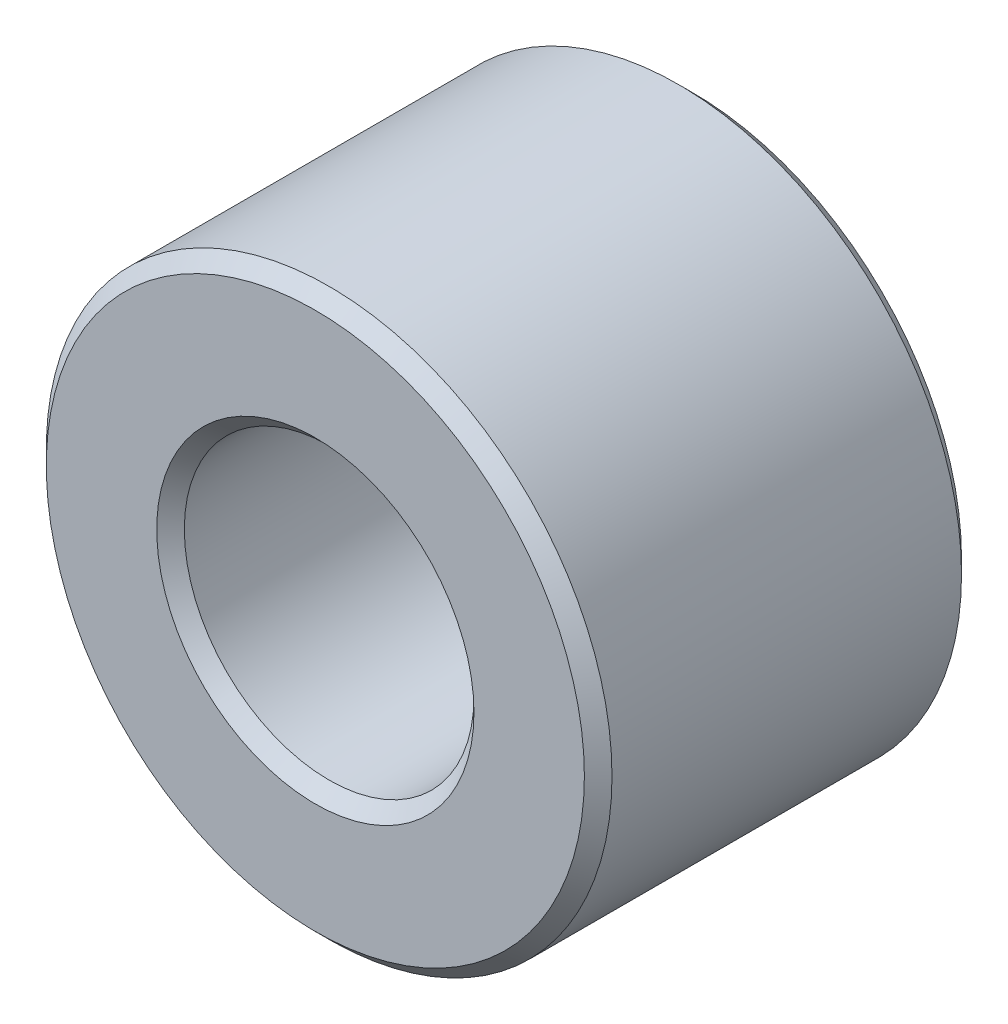
ISO-10303-21;
HEADER;
FILE_DESCRIPTION(('STEP AP214'),'2;1');
FILE_NAME('part.step','',(''),(''),'','','');
FILE_SCHEMA(('AUTOMOTIVE_DESIGN { 1 0 10303 214 1 1 1 1 }'));
ENDSEC;
DATA;
#1=APPLICATION_CONTEXT('core data for automotive mechanical design processes');
#2=APPLICATION_PROTOCOL_DEFINITION('international standard','automotive_design',2000,#1);
#3=PRODUCT_CONTEXT('',#1,'mechanical');
#4=PRODUCT('Part','Part','',(#3));
#5=PRODUCT_RELATED_PRODUCT_CATEGORY('part','',(#4));
#6=PRODUCT_DEFINITION_FORMATION('','',#4);
#7=PRODUCT_DEFINITION_CONTEXT('part definition',#1,'design');
#8=PRODUCT_DEFINITION('design','',#6,#7);
#9=PRODUCT_DEFINITION_SHAPE('','',#8);
#10=(LENGTH_UNIT() NAMED_UNIT(*) SI_UNIT(.MILLI.,.METRE.));
#11=(NAMED_UNIT(*) PLANE_ANGLE_UNIT() SI_UNIT($,.RADIAN.));
#12=(NAMED_UNIT(*) SI_UNIT($,.STERADIAN.) SOLID_ANGLE_UNIT());
#13=UNCERTAINTY_MEASURE_WITH_UNIT(LENGTH_MEASURE(1.E-05),#10,'distance_accuracy_value','');
#14=(GEOMETRIC_REPRESENTATION_CONTEXT(3) GLOBAL_UNCERTAINTY_ASSIGNED_CONTEXT((#13)) GLOBAL_UNIT_ASSIGNED_CONTEXT((#10,
#11,#12)) REPRESENTATION_CONTEXT('',''));
#15=CARTESIAN_POINT('',(0.,0.,0.));
#16=DIRECTION('',(0.,0.,1.));
#17=DIRECTION('',(1.,0.,0.));
#18=AXIS2_PLACEMENT_3D('',#15,#16,#17);
#19=CARTESIAN_POINT('',(0.,0.,-3.175));
#20=DIRECTION('',(0.,0.,1.));
#21=DIRECTION('',(1.,0.,0.));
#22=AXIS2_PLACEMENT_3D('',#19,#20,#21);
#23=CYLINDRICAL_SURFACE('',#22,4.7625);
#24=CARTESIAN_POINT('',(0.,0.,2.94259));
#25=DIRECTION('',(0.,0.,1.));
#26=DIRECTION('',(1.,0.,0.));
#27=AXIS2_PLACEMENT_3D('',#24,#25,#26);
#28=CIRCLE('',#27,4.7625);
#29=CARTESIAN_POINT('',(4.7625,0.,2.94259));
#30=VERTEX_POINT('',#29);
#31=EDGE_CURVE('E55',#30,#30,#28,.F.);
#32=ORIENTED_EDGE('',*,*,#31,.T.);
#33=EDGE_LOOP('',(#32));
#34=FACE_BOUND('',#33,.T.);
#35=CARTESIAN_POINT('',(0.,0.,-2.94259));
#36=DIRECTION('',(0.,0.,1.));
#37=DIRECTION('',(1.,0.,0.));
#38=AXIS2_PLACEMENT_3D('',#35,#36,#37);
#39=CIRCLE('',#38,4.7625);
#40=CARTESIAN_POINT('',(4.7625,0.,-2.94259));
#41=VERTEX_POINT('',#40);
#42=EDGE_CURVE('E58',#41,#41,#39,.T.);
#43=ORIENTED_EDGE('',*,*,#42,.T.);
#44=EDGE_LOOP('',(#43));
#45=FACE_BOUND('',#44,.T.);
#46=ADVANCED_FACE('F35',(#34,#45),#23,.T.);
#47=CARTESIAN_POINT('',(0.,0.,-3.175));
#48=DIRECTION('',(0.,0.,1.));
#49=DIRECTION('',(1.,0.,0.));
#50=AXIS2_PLACEMENT_3D('',#47,#48,#49);
#51=PLANE('',#50);
#52=CARTESIAN_POINT('',(0.,0.,-3.175));
#53=DIRECTION('',(0.,0.,1.));
#54=DIRECTION('',(1.,0.,0.));
#55=AXIS2_PLACEMENT_3D('',#52,#53,#54);
#56=CIRCLE('',#55,4.53009);
#57=CARTESIAN_POINT('',(4.53009,0.,-3.175));
#58=VERTEX_POINT('',#57);
#59=EDGE_CURVE('E46',#58,#58,#56,.F.);
#60=ORIENTED_EDGE('',*,*,#59,.T.);
#61=EDGE_LOOP('',(#60));
#62=FACE_BOUND('',#61,.T.);
#63=CARTESIAN_POINT('',(0.,0.,-3.175));
#64=DIRECTION('',(0.,0.,1.));
#65=DIRECTION('',(1.,0.,0.));
#66=AXIS2_PLACEMENT_3D('',#63,#64,#65);
#67=CIRCLE('',#66,2.67081);
#68=CARTESIAN_POINT('',(2.67081,0.,-3.175));
#69=VERTEX_POINT('',#68);
#70=EDGE_CURVE('E50',#69,#69,#67,.T.);
#71=ORIENTED_EDGE('',*,*,#70,.T.);
#72=EDGE_LOOP('',(#71));
#73=FACE_BOUND('',#72,.T.);
#74=ADVANCED_FACE('F83',(#62,#73),#51,.F.);
#75=CARTESIAN_POINT('',(0.,0.,-3.175));
#76=DIRECTION('',(0.,0.,1.));
#77=DIRECTION('',(1.,0.,0.));
#78=AXIS2_PLACEMENT_3D('',#75,#76,#77);
#79=CYLINDRICAL_SURFACE('',#78,2.4384);
#80=CARTESIAN_POINT('',(0.,0.,2.94259));
#81=DIRECTION('',(0.,0.,1.));
#82=DIRECTION('',(1.,0.,0.));
#83=AXIS2_PLACEMENT_3D('',#80,#81,#82);
#84=CIRCLE('',#83,2.4384);
#85=CARTESIAN_POINT('',(2.4384,0.,2.94259));
#86=VERTEX_POINT('',#85);
#87=EDGE_CURVE('E10',#86,#86,#84,.T.);
#88=ORIENTED_EDGE('',*,*,#87,.T.);
#89=EDGE_LOOP('',(#88));
#90=FACE_BOUND('',#89,.T.);
#91=CARTESIAN_POINT('',(0.,0.,-2.94259));
#92=DIRECTION('',(0.,0.,1.));
#93=DIRECTION('',(1.,0.,0.));
#94=AXIS2_PLACEMENT_3D('',#91,#92,#93);
#95=CIRCLE('',#94,2.4384);
#96=CARTESIAN_POINT('',(2.4384,0.,-2.94259));
#97=VERTEX_POINT('',#96);
#98=EDGE_CURVE('E42',#97,#97,#95,.F.);
#99=ORIENTED_EDGE('',*,*,#98,.T.);
#100=EDGE_LOOP('',(#99));
#101=FACE_BOUND('',#100,.T.);
#102=ADVANCED_FACE('F89',(#90,#101),#79,.F.);
#103=CARTESIAN_POINT('',(0.,0.,3.175));
#104=DIRECTION('',(0.,0.,1.));
#105=DIRECTION('',(1.,0.,0.));
#106=AXIS2_PLACEMENT_3D('',#103,#104,#105);
#107=PLANE('',#106);
#108=CARTESIAN_POINT('',(0.,0.,3.175));
#109=DIRECTION('',(0.,0.,1.));
#110=DIRECTION('',(1.,0.,0.));
#111=AXIS2_PLACEMENT_3D('',#108,#109,#110);
#112=CIRCLE('',#111,4.53009);
#113=CARTESIAN_POINT('',(4.53009,0.,3.175));
#114=VERTEX_POINT('',#113);
#115=EDGE_CURVE('E61',#114,#114,#112,.T.);
#116=ORIENTED_EDGE('',*,*,#115,.T.);
#117=EDGE_LOOP('',(#116));
#118=FACE_BOUND('',#117,.T.);
#119=CARTESIAN_POINT('',(0.,0.,3.175));
#120=DIRECTION('',(0.,0.,1.));
#121=DIRECTION('',(1.,0.,0.));
#122=AXIS2_PLACEMENT_3D('',#119,#120,#121);
#123=CIRCLE('',#122,2.67081);
#124=CARTESIAN_POINT('',(2.67081,0.,3.175));
#125=VERTEX_POINT('',#124);
#126=EDGE_CURVE('E64',#125,#125,#123,.F.);
#127=ORIENTED_EDGE('',*,*,#126,.T.);
#128=EDGE_LOOP('',(#127));
#129=FACE_BOUND('',#128,.T.);
#130=ADVANCED_FACE('F68',(#118,#129),#107,.T.);
#131=CARTESIAN_POINT('',(0.,0.,3.175));
#132=DIRECTION('',(0.,0.,-1.));
#133=DIRECTION('',(-1.,0.,0.));
#134=AXIS2_PLACEMENT_3D('',#131,#132,#133);
#135=CONICAL_SURFACE('',#134,4.53009,0.785398163397446);
#136=ORIENTED_EDGE('',*,*,#31,.F.);
#137=EDGE_LOOP('',(#136));
#138=FACE_BOUND('',#137,.T.);
#139=ORIENTED_EDGE('',*,*,#115,.F.);
#140=EDGE_LOOP('',(#139));
#141=FACE_BOUND('',#140,.T.);
#142=ADVANCED_FACE('F79',(#138,#141),#135,.T.);
#143=CARTESIAN_POINT('',(0.,0.,-2.94259));
#144=DIRECTION('',(0.,0.,1.));
#145=DIRECTION('',(1.,0.,0.));
#146=AXIS2_PLACEMENT_3D('',#143,#144,#145);
#147=CONICAL_SURFACE('',#146,4.7625,0.785398163397448);
#148=ORIENTED_EDGE('',*,*,#59,.F.);
#149=EDGE_LOOP('',(#148));
#150=FACE_BOUND('',#149,.T.);
#151=ORIENTED_EDGE('',*,*,#42,.F.);
#152=EDGE_LOOP('',(#151));
#153=FACE_BOUND('',#152,.T.);
#154=ADVANCED_FACE('F73',(#150,#153),#147,.T.);
#155=CARTESIAN_POINT('',(0.,0.,2.94259));
#156=DIRECTION('',(0.,0.,1.));
#157=DIRECTION('',(1.,0.,0.));
#158=AXIS2_PLACEMENT_3D('',#155,#156,#157);
#159=CONICAL_SURFACE('',#158,2.4384,0.785398163397448);
#160=ORIENTED_EDGE('',*,*,#126,.F.);
#161=EDGE_LOOP('',(#160));
#162=FACE_BOUND('',#161,.T.);
#163=ORIENTED_EDGE('',*,*,#87,.F.);
#164=EDGE_LOOP('',(#163));
#165=FACE_BOUND('',#164,.T.);
#166=ADVANCED_FACE('F70',(#162,#165),#159,.F.);
#167=CARTESIAN_POINT('',(0.,0.,-3.175));
#168=DIRECTION('',(0.,0.,-1.));
#169=DIRECTION('',(-1.,0.,0.));
#170=AXIS2_PLACEMENT_3D('',#167,#168,#169);
#171=CONICAL_SURFACE('',#170,2.67081,0.785398163397447);
#172=ORIENTED_EDGE('',*,*,#98,.F.);
#173=EDGE_LOOP('',(#172));
#174=FACE_BOUND('',#173,.T.);
#175=ORIENTED_EDGE('',*,*,#70,.F.);
#176=EDGE_LOOP('',(#175));
#177=FACE_BOUND('',#176,.T.);
#178=ADVANCED_FACE('F37',(#174,#177),#171,.F.);
#179=CLOSED_SHELL('',(#46,#74,#102,#130,#142,#154,#166,#178));
#180=MANIFOLD_SOLID_BREP('B2',#179);
#181=ADVANCED_BREP_SHAPE_REPRESENTATION('',(#18,#180),#14);
#182=SHAPE_DEFINITION_REPRESENTATION(#9,#181);
ENDSEC;
END-ISO-10303-21;
